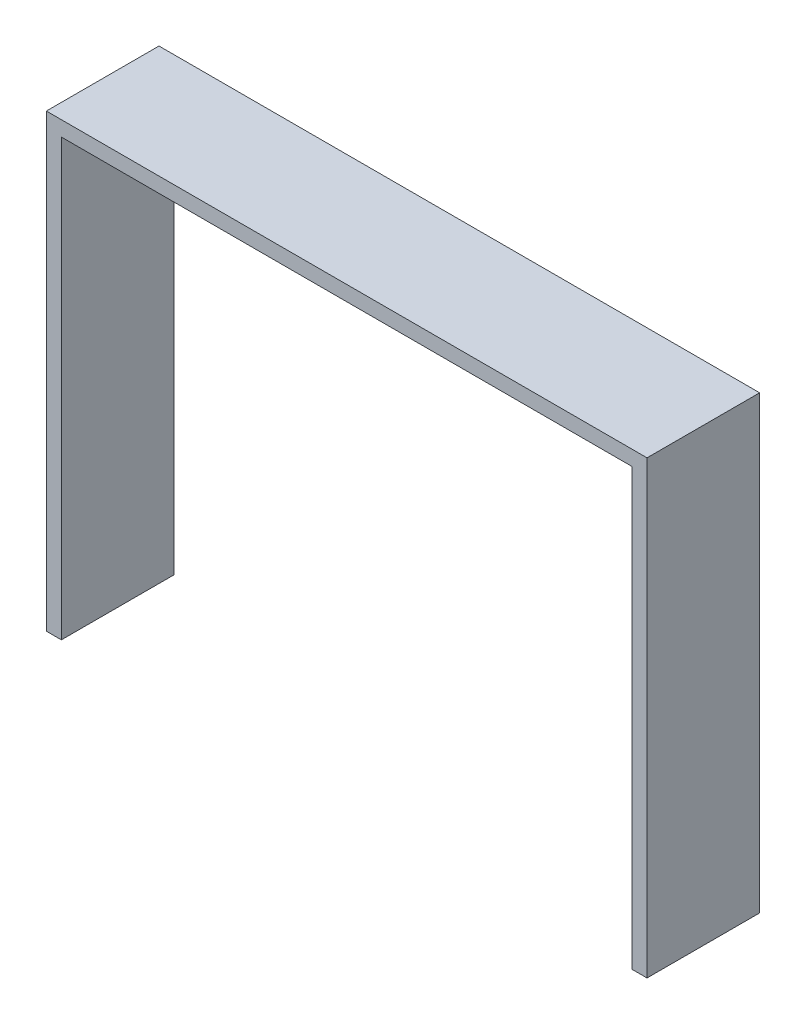
ISO-10303-21;
HEADER;
FILE_DESCRIPTION(('STEP AP214'),'2;1');
FILE_NAME('part.step','',(''),(''),'','','');
FILE_SCHEMA(('AUTOMOTIVE_DESIGN { 1 0 10303 214 1 1 1 1 }'));
ENDSEC;
DATA;
#1=APPLICATION_CONTEXT('core data for automotive mechanical design processes');
#2=APPLICATION_PROTOCOL_DEFINITION('international standard','automotive_design',2000,#1);
#3=PRODUCT_CONTEXT('',#1,'mechanical');
#4=PRODUCT('Part','Part','',(#3));
#5=PRODUCT_RELATED_PRODUCT_CATEGORY('part','',(#4));
#6=PRODUCT_DEFINITION_FORMATION('','',#4);
#7=PRODUCT_DEFINITION_CONTEXT('part definition',#1,'design');
#8=PRODUCT_DEFINITION('design','',#6,#7);
#9=PRODUCT_DEFINITION_SHAPE('','',#8);
#10=(LENGTH_UNIT() NAMED_UNIT(*) SI_UNIT(.MILLI.,.METRE.));
#11=(NAMED_UNIT(*) PLANE_ANGLE_UNIT() SI_UNIT($,.RADIAN.));
#12=(NAMED_UNIT(*) SI_UNIT($,.STERADIAN.) SOLID_ANGLE_UNIT());
#13=UNCERTAINTY_MEASURE_WITH_UNIT(LENGTH_MEASURE(1.E-05),#10,'distance_accuracy_value','');
#14=(GEOMETRIC_REPRESENTATION_CONTEXT(3) GLOBAL_UNCERTAINTY_ASSIGNED_CONTEXT((#13)) GLOBAL_UNIT_ASSIGNED_CONTEXT((#10,
#11,#12)) REPRESENTATION_CONTEXT('',''));
#15=CARTESIAN_POINT('',(0.,0.,0.));
#16=DIRECTION('',(0.,0.,1.));
#17=DIRECTION('',(1.,0.,0.));
#18=AXIS2_PLACEMENT_3D('',#15,#16,#17);
#19=CARTESIAN_POINT('',(-28.,24.3734693877551,-12.75));
#20=DIRECTION('',(0.,1.,0.));
#21=DIRECTION('',(-1.,0.,0.));
#22=AXIS2_PLACEMENT_3D('',#19,#20,#21);
#23=PLANE('',#22);
#24=DIRECTION('',(-1.,0.,0.));
#25=VECTOR('',#24,1.);
#26=CARTESIAN_POINT('',(-28.,24.3734693877551,-2.25));
#27=LINE('',#26,#25);
#28=CARTESIAN_POINT('',(28.,24.3734693877551,-2.25));
#29=VERTEX_POINT('',#28);
#30=CARTESIAN_POINT('',(-28.,24.3734693877551,-2.25));
#31=VERTEX_POINT('',#30);
#32=EDGE_CURVE('E139',#29,#31,#27,.T.);
#33=ORIENTED_EDGE('',*,*,#32,.F.);
#34=DIRECTION('',(0.,0.,1.));
#35=VECTOR('',#34,1.);
#36=CARTESIAN_POINT('',(28.,24.3734693877551,-12.75));
#37=LINE('',#36,#35);
#38=CARTESIAN_POINT('',(28.,24.3734693877551,-12.75));
#39=VERTEX_POINT('',#38);
#40=EDGE_CURVE('E12',#39,#29,#37,.T.);
#41=ORIENTED_EDGE('',*,*,#40,.F.);
#42=DIRECTION('',(-1.,0.,0.));
#43=VECTOR('',#42,1.);
#44=CARTESIAN_POINT('',(-28.,24.3734693877551,-12.75));
#45=LINE('',#44,#43);
#46=CARTESIAN_POINT('',(-28.,24.3734693877551,-12.75));
#47=VERTEX_POINT('',#46);
#48=EDGE_CURVE('E159',#39,#47,#45,.T.);
#49=ORIENTED_EDGE('',*,*,#48,.T.);
#50=DIRECTION('',(0.,0.,1.));
#51=VECTOR('',#50,1.);
#52=CARTESIAN_POINT('',(-28.,24.3734693877551,-12.75));
#53=LINE('',#52,#51);
#54=EDGE_CURVE('E45',#47,#31,#53,.T.);
#55=ORIENTED_EDGE('',*,*,#54,.T.);
#56=EDGE_LOOP('',(#33,#41,#49,#55));
#57=FACE_BOUND('',#56,.T.);
#58=ADVANCED_FACE('F42',(#57),#23,.T.);
#59=CARTESIAN_POINT('',(28.,-17.6265306122449,-12.75));
#60=DIRECTION('',(1.,0.,0.));
#61=DIRECTION('',(0.,0.,-1.));
#62=AXIS2_PLACEMENT_3D('',#59,#60,#61);
#63=PLANE('',#62);
#64=DIRECTION('',(0.,1.,0.));
#65=VECTOR('',#64,1.);
#66=CARTESIAN_POINT('',(28.,-17.6265306122449,-2.25));
#67=LINE('',#66,#65);
#68=CARTESIAN_POINT('',(28.,-17.6265306122449,-2.25));
#69=VERTEX_POINT('',#68);
#70=EDGE_CURVE('E157',#69,#29,#67,.T.);
#71=ORIENTED_EDGE('',*,*,#70,.F.);
#72=DIRECTION('',(0.,0.,1.));
#73=VECTOR('',#72,1.);
#74=CARTESIAN_POINT('',(28.,-17.6265306122449,-12.75));
#75=LINE('',#74,#73);
#76=CARTESIAN_POINT('',(28.,-17.6265306122449,-12.75));
#77=VERTEX_POINT('',#76);
#78=EDGE_CURVE('E51',#77,#69,#75,.T.);
#79=ORIENTED_EDGE('',*,*,#78,.F.);
#80=DIRECTION('',(0.,1.,0.));
#81=VECTOR('',#80,1.);
#82=CARTESIAN_POINT('',(28.,-17.6265306122449,-12.75));
#83=LINE('',#82,#81);
#84=EDGE_CURVE('E129',#77,#39,#83,.T.);
#85=ORIENTED_EDGE('',*,*,#84,.T.);
#86=ORIENTED_EDGE('',*,*,#40,.T.);
#87=EDGE_LOOP('',(#71,#79,#85,#86));
#88=FACE_BOUND('',#87,.T.);
#89=ADVANCED_FACE('F171',(#88),#63,.T.);
#90=CARTESIAN_POINT('',(26.6,-17.6265306122449,-12.75));
#91=DIRECTION('',(0.,-1.,0.));
#92=DIRECTION('',(1.,0.,0.));
#93=AXIS2_PLACEMENT_3D('',#90,#91,#92);
#94=PLANE('',#93);
#95=DIRECTION('',(1.,0.,0.));
#96=VECTOR('',#95,1.);
#97=CARTESIAN_POINT('',(26.6,-17.6265306122449,-2.25));
#98=LINE('',#97,#96);
#99=CARTESIAN_POINT('',(26.6,-17.6265306122449,-2.25));
#100=VERTEX_POINT('',#99);
#101=EDGE_CURVE('E116',#100,#69,#98,.T.);
#102=ORIENTED_EDGE('',*,*,#101,.F.);
#103=DIRECTION('',(0.,0.,1.));
#104=VECTOR('',#103,1.);
#105=CARTESIAN_POINT('',(26.6,-17.6265306122449,-12.75));
#106=LINE('',#105,#104);
#107=CARTESIAN_POINT('',(26.6,-17.6265306122449,-12.75));
#108=VERTEX_POINT('',#107);
#109=EDGE_CURVE('E111',#108,#100,#106,.T.);
#110=ORIENTED_EDGE('',*,*,#109,.F.);
#111=DIRECTION('',(1.,0.,0.));
#112=VECTOR('',#111,1.);
#113=CARTESIAN_POINT('',(26.6,-17.6265306122449,-12.75));
#114=LINE('',#113,#112);
#115=EDGE_CURVE('E114',#108,#77,#114,.T.);
#116=ORIENTED_EDGE('',*,*,#115,.T.);
#117=ORIENTED_EDGE('',*,*,#78,.T.);
#118=EDGE_LOOP('',(#102,#110,#116,#117));
#119=FACE_BOUND('',#118,.T.);
#120=ADVANCED_FACE('F113',(#119),#94,.T.);
#121=CARTESIAN_POINT('',(26.6,22.9734693877551,-12.75));
#122=DIRECTION('',(-1.,0.,0.));
#123=DIRECTION('',(0.,-1.,0.));
#124=AXIS2_PLACEMENT_3D('',#121,#122,#123);
#125=PLANE('',#124);
#126=DIRECTION('',(0.,-1.,0.));
#127=VECTOR('',#126,1.);
#128=CARTESIAN_POINT('',(26.6,22.9734693877551,-2.25));
#129=LINE('',#128,#127);
#130=CARTESIAN_POINT('',(26.6,22.9734693877551,-2.25));
#131=VERTEX_POINT('',#130);
#132=EDGE_CURVE('E154',#131,#100,#129,.T.);
#133=ORIENTED_EDGE('',*,*,#132,.F.);
#134=DIRECTION('',(0.,0.,1.));
#135=VECTOR('',#134,1.);
#136=CARTESIAN_POINT('',(26.6,22.9734693877551,-12.75));
#137=LINE('',#136,#135);
#138=CARTESIAN_POINT('',(26.6,22.9734693877551,-12.75));
#139=VERTEX_POINT('',#138);
#140=EDGE_CURVE('E121',#139,#131,#137,.T.);
#141=ORIENTED_EDGE('',*,*,#140,.F.);
#142=DIRECTION('',(0.,-1.,0.));
#143=VECTOR('',#142,1.);
#144=CARTESIAN_POINT('',(26.6,22.9734693877551,-12.75));
#145=LINE('',#144,#143);
#146=EDGE_CURVE('E127',#139,#108,#145,.T.);
#147=ORIENTED_EDGE('',*,*,#146,.T.);
#148=ORIENTED_EDGE('',*,*,#109,.T.);
#149=EDGE_LOOP('',(#133,#141,#147,#148));
#150=FACE_BOUND('',#149,.T.);
#151=ADVANCED_FACE('F131',(#150),#125,.T.);
#152=CARTESIAN_POINT('',(-26.6,22.9734693877551,-12.75));
#153=DIRECTION('',(0.,-1.,0.));
#154=DIRECTION('',(1.,0.,0.));
#155=AXIS2_PLACEMENT_3D('',#152,#153,#154);
#156=PLANE('',#155);
#157=DIRECTION('',(1.,0.,0.));
#158=VECTOR('',#157,1.);
#159=CARTESIAN_POINT('',(-26.6,22.9734693877551,-2.25));
#160=LINE('',#159,#158);
#161=CARTESIAN_POINT('',(-26.6,22.9734693877551,-2.25));
#162=VERTEX_POINT('',#161);
#163=EDGE_CURVE('E151',#162,#131,#160,.T.);
#164=ORIENTED_EDGE('',*,*,#163,.F.);
#165=DIRECTION('',(0.,0.,1.));
#166=VECTOR('',#165,1.);
#167=CARTESIAN_POINT('',(-26.6,22.9734693877551,-12.75));
#168=LINE('',#167,#166);
#169=CARTESIAN_POINT('',(-26.6,22.9734693877551,-12.75));
#170=VERTEX_POINT('',#169);
#171=EDGE_CURVE('E163',#170,#162,#168,.T.);
#172=ORIENTED_EDGE('',*,*,#171,.F.);
#173=DIRECTION('',(1.,0.,0.));
#174=VECTOR('',#173,1.);
#175=CARTESIAN_POINT('',(-26.6,22.9734693877551,-12.75));
#176=LINE('',#175,#174);
#177=EDGE_CURVE('E132',#170,#139,#176,.T.);
#178=ORIENTED_EDGE('',*,*,#177,.T.);
#179=ORIENTED_EDGE('',*,*,#140,.T.);
#180=EDGE_LOOP('',(#164,#172,#178,#179));
#181=FACE_BOUND('',#180,.T.);
#182=ADVANCED_FACE('F184',(#181),#156,.T.);
#183=CARTESIAN_POINT('',(-26.6,22.9734693877551,-12.75));
#184=DIRECTION('',(1.,0.,0.));
#185=DIRECTION('',(0.,1.,0.));
#186=AXIS2_PLACEMENT_3D('',#183,#184,#185);
#187=PLANE('',#186);
#188=DIRECTION('',(0.,1.,0.));
#189=VECTOR('',#188,1.);
#190=CARTESIAN_POINT('',(-26.6,22.9734693877551,-2.25));
#191=LINE('',#190,#189);
#192=CARTESIAN_POINT('',(-26.6,-17.6265306122449,-2.25));
#193=VERTEX_POINT('',#192);
#194=EDGE_CURVE('E148',#193,#162,#191,.T.);
#195=ORIENTED_EDGE('',*,*,#194,.F.);
#196=DIRECTION('',(0.,0.,1.));
#197=VECTOR('',#196,1.);
#198=CARTESIAN_POINT('',(-26.6,-17.6265306122449,-12.75));
#199=LINE('',#198,#197);
#200=CARTESIAN_POINT('',(-26.6,-17.6265306122449,-12.75));
#201=VERTEX_POINT('',#200);
#202=EDGE_CURVE('E165',#201,#193,#199,.T.);
#203=ORIENTED_EDGE('',*,*,#202,.F.);
#204=DIRECTION('',(0.,1.,0.));
#205=VECTOR('',#204,1.);
#206=CARTESIAN_POINT('',(-26.6,22.9734693877551,-12.75));
#207=LINE('',#206,#205);
#208=EDGE_CURVE('E134',#201,#170,#207,.T.);
#209=ORIENTED_EDGE('',*,*,#208,.T.);
#210=ORIENTED_EDGE('',*,*,#171,.T.);
#211=EDGE_LOOP('',(#195,#203,#209,#210));
#212=FACE_BOUND('',#211,.T.);
#213=ADVANCED_FACE('F187',(#212),#187,.T.);
#214=CARTESIAN_POINT('',(-28.,-17.6265306122449,-12.75));
#215=DIRECTION('',(0.,-1.,0.));
#216=DIRECTION('',(0.,0.,-1.));
#217=AXIS2_PLACEMENT_3D('',#214,#215,#216);
#218=PLANE('',#217);
#219=DIRECTION('',(1.,0.,0.));
#220=VECTOR('',#219,1.);
#221=CARTESIAN_POINT('',(-28.,-17.6265306122449,-2.25));
#222=LINE('',#221,#220);
#223=CARTESIAN_POINT('',(-28.,-17.6265306122449,-2.25));
#224=VERTEX_POINT('',#223);
#225=EDGE_CURVE('E145',#224,#193,#222,.T.);
#226=ORIENTED_EDGE('',*,*,#225,.F.);
#227=DIRECTION('',(0.,0.,1.));
#228=VECTOR('',#227,1.);
#229=CARTESIAN_POINT('',(-28.,-17.6265306122449,-12.75));
#230=LINE('',#229,#228);
#231=CARTESIAN_POINT('',(-28.,-17.6265306122449,-12.75));
#232=VERTEX_POINT('',#231);
#233=EDGE_CURVE('E166',#232,#224,#230,.T.);
#234=ORIENTED_EDGE('',*,*,#233,.F.);
#235=DIRECTION('',(1.,0.,0.));
#236=VECTOR('',#235,1.);
#237=CARTESIAN_POINT('',(-28.,-17.6265306122449,-12.75));
#238=LINE('',#237,#236);
#239=EDGE_CURVE('E262',#232,#201,#238,.T.);
#240=ORIENTED_EDGE('',*,*,#239,.T.);
#241=ORIENTED_EDGE('',*,*,#202,.T.);
#242=EDGE_LOOP('',(#226,#234,#240,#241));
#243=FACE_BOUND('',#242,.T.);
#244=ADVANCED_FACE('F191',(#243),#218,.T.);
#245=CARTESIAN_POINT('',(-28.,-17.6265306122449,-12.75));
#246=DIRECTION('',(-1.,0.,0.));
#247=DIRECTION('',(0.,0.,1.));
#248=AXIS2_PLACEMENT_3D('',#245,#246,#247);
#249=PLANE('',#248);
#250=DIRECTION('',(0.,-1.,0.));
#251=VECTOR('',#250,1.);
#252=CARTESIAN_POINT('',(-28.,-17.6265306122449,-2.25));
#253=LINE('',#252,#251);
#254=EDGE_CURVE('E142',#31,#224,#253,.T.);
#255=ORIENTED_EDGE('',*,*,#254,.F.);
#256=ORIENTED_EDGE('',*,*,#54,.F.);
#257=DIRECTION('',(0.,-1.,0.));
#258=VECTOR('',#257,1.);
#259=CARTESIAN_POINT('',(-28.,-17.6265306122449,-12.75));
#260=LINE('',#259,#258);
#261=EDGE_CURVE('E263',#47,#232,#260,.T.);
#262=ORIENTED_EDGE('',*,*,#261,.T.);
#263=ORIENTED_EDGE('',*,*,#233,.T.);
#264=EDGE_LOOP('',(#255,#256,#262,#263));
#265=FACE_BOUND('',#264,.T.);
#266=ADVANCED_FACE('F168',(#265),#249,.T.);
#267=CARTESIAN_POINT('',(0.,3.37346938775509,-12.75));
#268=DIRECTION('',(0.,0.,1.));
#269=DIRECTION('',(1.,0.,0.));
#270=AXIS2_PLACEMENT_3D('',#267,#268,#269);
#271=PLANE('',#270);
#272=ORIENTED_EDGE('',*,*,#48,.F.);
#273=ORIENTED_EDGE('',*,*,#84,.F.);
#274=ORIENTED_EDGE('',*,*,#115,.F.);
#275=ORIENTED_EDGE('',*,*,#146,.F.);
#276=ORIENTED_EDGE('',*,*,#177,.F.);
#277=ORIENTED_EDGE('',*,*,#208,.F.);
#278=ORIENTED_EDGE('',*,*,#239,.F.);
#279=ORIENTED_EDGE('',*,*,#261,.F.);
#280=EDGE_LOOP('',(#272,#273,#274,#275,#276,#277,#278,#279));
#281=FACE_BOUND('',#280,.T.);
#282=ADVANCED_FACE('F125',(#281),#271,.F.);
#283=CARTESIAN_POINT('',(0.,3.37346938775509,-2.25));
#284=DIRECTION('',(0.,0.,1.));
#285=DIRECTION('',(1.,0.,0.));
#286=AXIS2_PLACEMENT_3D('',#283,#284,#285);
#287=PLANE('',#286);
#288=ORIENTED_EDGE('',*,*,#32,.T.);
#289=ORIENTED_EDGE('',*,*,#254,.T.);
#290=ORIENTED_EDGE('',*,*,#225,.T.);
#291=ORIENTED_EDGE('',*,*,#194,.T.);
#292=ORIENTED_EDGE('',*,*,#163,.T.);
#293=ORIENTED_EDGE('',*,*,#132,.T.);
#294=ORIENTED_EDGE('',*,*,#101,.T.);
#295=ORIENTED_EDGE('',*,*,#70,.T.);
#296=EDGE_LOOP('',(#288,#289,#290,#291,#292,#293,#294,#295));
#297=FACE_BOUND('',#296,.T.);
#298=ADVANCED_FACE('F170',(#297),#287,.T.);
#299=CLOSED_SHELL('',(#58,#89,#120,#151,#182,#213,#244,#266,#282,#298));
#300=MANIFOLD_SOLID_BREP('B2',#299);
#301=ADVANCED_BREP_SHAPE_REPRESENTATION('',(#18,#300),#14);
#302=SHAPE_DEFINITION_REPRESENTATION(#9,#301);
ENDSEC;
END-ISO-10303-21;
